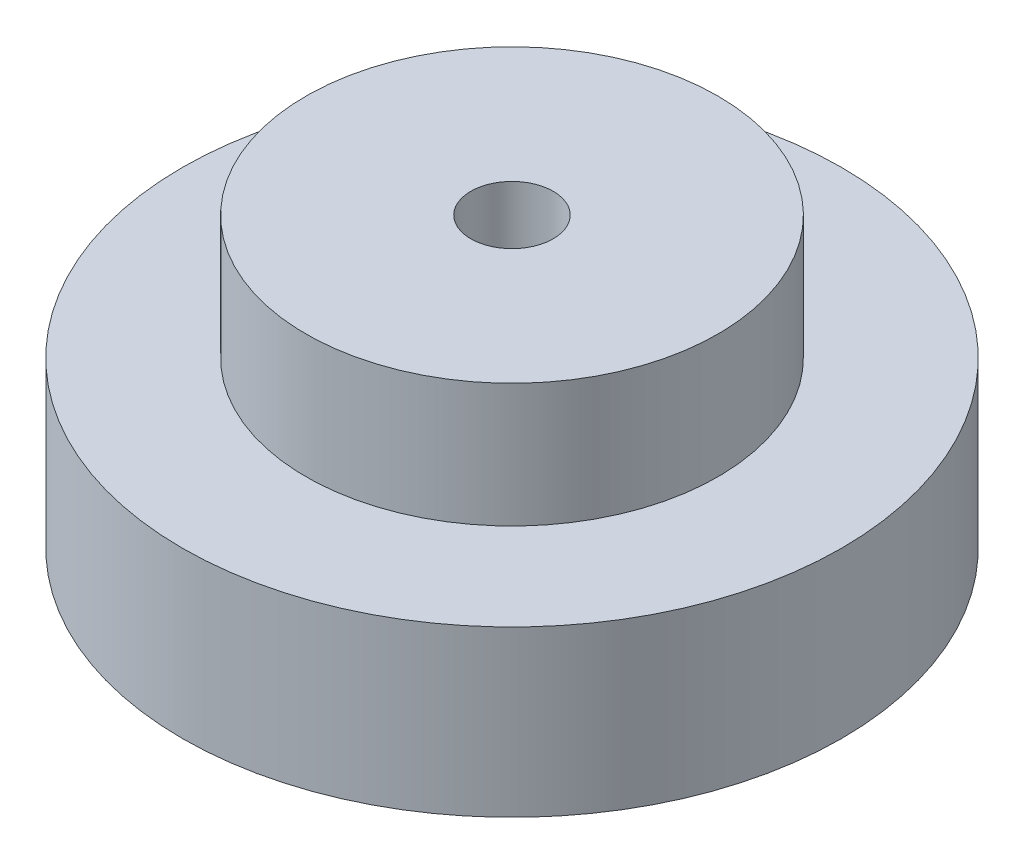
ISO-10303-21;
HEADER;
FILE_DESCRIPTION(('STEP AP214'),'2;1');
FILE_NAME('part.step','',(''),(''),'','','');
FILE_SCHEMA(('AUTOMOTIVE_DESIGN { 1 0 10303 214 1 1 1 1 }'));
ENDSEC;
DATA;
#1=APPLICATION_CONTEXT('core data for automotive mechanical design processes');
#2=APPLICATION_PROTOCOL_DEFINITION('international standard','automotive_design',2000,#1);
#3=PRODUCT_CONTEXT('',#1,'mechanical');
#4=PRODUCT('Part','Part','',(#3));
#5=PRODUCT_RELATED_PRODUCT_CATEGORY('part','',(#4));
#6=PRODUCT_DEFINITION_FORMATION('','',#4);
#7=PRODUCT_DEFINITION_CONTEXT('part definition',#1,'design');
#8=PRODUCT_DEFINITION('design','',#6,#7);
#9=PRODUCT_DEFINITION_SHAPE('','',#8);
#10=(LENGTH_UNIT() NAMED_UNIT(*) SI_UNIT(.MILLI.,.METRE.));
#11=(NAMED_UNIT(*) PLANE_ANGLE_UNIT() SI_UNIT($,.RADIAN.));
#12=(NAMED_UNIT(*) SI_UNIT($,.STERADIAN.) SOLID_ANGLE_UNIT());
#13=UNCERTAINTY_MEASURE_WITH_UNIT(LENGTH_MEASURE(1.E-05),#10,'distance_accuracy_value','');
#14=(GEOMETRIC_REPRESENTATION_CONTEXT(3) GLOBAL_UNCERTAINTY_ASSIGNED_CONTEXT((#13)) GLOBAL_UNIT_ASSIGNED_CONTEXT((#10,
#11,#12)) REPRESENTATION_CONTEXT('',''));
#15=CARTESIAN_POINT('',(0.,0.,0.));
#16=DIRECTION('',(0.,0.,1.));
#17=DIRECTION('',(1.,0.,0.));
#18=AXIS2_PLACEMENT_3D('',#15,#16,#17);
#19=CARTESIAN_POINT('',(0.,-30.,0.));
#20=DIRECTION('',(0.,-1.,0.));
#21=DIRECTION('',(0.,0.,-1.));
#22=AXIS2_PLACEMENT_3D('',#19,#20,#21);
#23=PLANE('',#22);
#24=CARTESIAN_POINT('',(0.,-30.,0.));
#25=DIRECTION('',(0.,-1.,0.));
#26=DIRECTION('',(0.,0.,-1.));
#27=AXIS2_PLACEMENT_3D('',#24,#25,#26);
#28=CIRCLE('',#27,2.49999999999999);
#29=CARTESIAN_POINT('',(0.,-30.,-2.49999999999999));
#30=VERTEX_POINT('',#29);
#31=EDGE_CURVE('E72',#30,#30,#28,.T.);
#32=ORIENTED_EDGE('',*,*,#31,.F.);
#33=EDGE_LOOP('',(#32));
#34=FACE_BOUND('',#33,.T.);
#35=CARTESIAN_POINT('',(0.,-30.,0.));
#36=DIRECTION('',(0.,-1.,0.));
#37=DIRECTION('',(0.,0.,-1.));
#38=AXIS2_PLACEMENT_3D('',#35,#36,#37);
#39=CIRCLE('',#38,15.);
#40=CARTESIAN_POINT('',(0.,-30.,-15.));
#41=VERTEX_POINT('',#40);
#42=EDGE_CURVE('E66',#41,#41,#39,.T.);
#43=ORIENTED_EDGE('',*,*,#42,.T.);
#44=EDGE_LOOP('',(#43));
#45=FACE_BOUND('',#44,.T.);
#46=ADVANCED_FACE('F38',(#34,#45),#23,.T.);
#47=CARTESIAN_POINT('',(10.,0.,0.));
#48=DIRECTION('',(0.,1.,0.));
#49=DIRECTION('',(0.,0.,1.));
#50=AXIS2_PLACEMENT_3D('',#47,#48,#49);
#51=PLANE('',#50);
#52=CARTESIAN_POINT('',(0.,0.,0.));
#53=DIRECTION('',(0.,1.,0.));
#54=DIRECTION('',(0.,0.,1.));
#55=AXIS2_PLACEMENT_3D('',#52,#53,#54);
#56=CIRCLE('',#55,2.49999999999999);
#57=CARTESIAN_POINT('',(0.,0.,2.49999999999999));
#58=VERTEX_POINT('',#57);
#59=EDGE_CURVE('E69',#58,#58,#56,.T.);
#60=ORIENTED_EDGE('',*,*,#59,.F.);
#61=EDGE_LOOP('',(#60));
#62=FACE_BOUND('',#61,.T.);
#63=CARTESIAN_POINT('',(0.,0.,0.));
#64=DIRECTION('',(0.,-1.,0.));
#65=DIRECTION('',(0.,0.,-1.));
#66=AXIS2_PLACEMENT_3D('',#63,#64,#65);
#67=CIRCLE('',#66,10.);
#68=CARTESIAN_POINT('',(0.,0.,-10.));
#69=VERTEX_POINT('',#68);
#70=EDGE_CURVE('E10',#69,#69,#67,.T.);
#71=ORIENTED_EDGE('',*,*,#70,.F.);
#72=EDGE_LOOP('',(#71));
#73=FACE_BOUND('',#72,.T.);
#74=ADVANCED_FACE('F80',(#62,#73),#51,.T.);
#75=CARTESIAN_POINT('',(0.,-30.,0.));
#76=DIRECTION('',(0.,-1.,0.));
#77=DIRECTION('',(0.,0.,-1.));
#78=AXIS2_PLACEMENT_3D('',#75,#76,#77);
#79=CYLINDRICAL_SURFACE('',#78,10.);
#80=ORIENTED_EDGE('',*,*,#70,.T.);
#81=EDGE_LOOP('',(#80));
#82=FACE_BOUND('',#81,.T.);
#83=CARTESIAN_POINT('',(0.,30.,0.));
#84=DIRECTION('',(0.,-1.,0.));
#85=DIRECTION('',(0.,0.,-1.));
#86=AXIS2_PLACEMENT_3D('',#83,#84,#85);
#87=CIRCLE('',#86,10.);
#88=CARTESIAN_POINT('',(0.,30.,-10.));
#89=VERTEX_POINT('',#88);
#90=EDGE_CURVE('E44',#89,#89,#87,.T.);
#91=ORIENTED_EDGE('',*,*,#90,.F.);
#92=EDGE_LOOP('',(#91));
#93=FACE_BOUND('',#92,.T.);
#94=ADVANCED_FACE('F112',(#82,#93),#79,.F.);
#95=CARTESIAN_POINT('',(10.,30.,0.));
#96=DIRECTION('',(0.,1.,0.));
#97=DIRECTION('',(0.,0.,1.));
#98=AXIS2_PLACEMENT_3D('',#95,#96,#97);
#99=PLANE('',#98);
#100=ORIENTED_EDGE('',*,*,#90,.T.);
#101=EDGE_LOOP('',(#100));
#102=FACE_BOUND('',#101,.T.);
#103=CARTESIAN_POINT('',(0.,30.,0.));
#104=DIRECTION('',(0.,-1.,0.));
#105=DIRECTION('',(0.,0.,-1.));
#106=AXIS2_PLACEMENT_3D('',#103,#104,#105);
#107=CIRCLE('',#106,50.);
#108=CARTESIAN_POINT('',(0.,30.,-50.));
#109=VERTEX_POINT('',#108);
#110=EDGE_CURVE('E48',#109,#109,#107,.T.);
#111=ORIENTED_EDGE('',*,*,#110,.F.);
#112=EDGE_LOOP('',(#111));
#113=FACE_BOUND('',#112,.T.);
#114=ADVANCED_FACE('F108',(#102,#113),#99,.T.);
#115=CARTESIAN_POINT('',(0.,-30.,0.));
#116=DIRECTION('',(0.,-1.,0.));
#117=DIRECTION('',(0.,0.,-1.));
#118=AXIS2_PLACEMENT_3D('',#115,#116,#117);
#119=CYLINDRICAL_SURFACE('',#118,50.);
#120=ORIENTED_EDGE('',*,*,#110,.T.);
#121=EDGE_LOOP('',(#120));
#122=FACE_BOUND('',#121,.T.);
#123=CARTESIAN_POINT('',(0.,0.,0.));
#124=DIRECTION('',(0.,-1.,0.));
#125=DIRECTION('',(0.,0.,-1.));
#126=AXIS2_PLACEMENT_3D('',#123,#124,#125);
#127=CIRCLE('',#126,50.);
#128=CARTESIAN_POINT('',(0.,0.,-50.));
#129=VERTEX_POINT('',#128);
#130=EDGE_CURVE('E52',#129,#129,#127,.T.);
#131=ORIENTED_EDGE('',*,*,#130,.F.);
#132=EDGE_LOOP('',(#131));
#133=FACE_BOUND('',#132,.T.);
#134=ADVANCED_FACE('F104',(#122,#133),#119,.T.);
#135=CARTESIAN_POINT('',(50.,0.,0.));
#136=DIRECTION('',(0.,1.,0.));
#137=DIRECTION('',(0.,0.,1.));
#138=AXIS2_PLACEMENT_3D('',#135,#136,#137);
#139=PLANE('',#138);
#140=ORIENTED_EDGE('',*,*,#130,.T.);
#141=EDGE_LOOP('',(#140));
#142=FACE_BOUND('',#141,.T.);
#143=CARTESIAN_POINT('',(0.,0.,0.));
#144=DIRECTION('',(0.,-1.,0.));
#145=DIRECTION('',(0.,0.,-1.));
#146=AXIS2_PLACEMENT_3D('',#143,#144,#145);
#147=CIRCLE('',#146,80.);
#148=CARTESIAN_POINT('',(0.,0.,-80.));
#149=VERTEX_POINT('',#148);
#150=EDGE_CURVE('E57',#149,#149,#147,.T.);
#151=ORIENTED_EDGE('',*,*,#150,.F.);
#152=EDGE_LOOP('',(#151));
#153=FACE_BOUND('',#152,.T.);
#154=ADVANCED_FACE('F100',(#142,#153),#139,.T.);
#155=CARTESIAN_POINT('',(0.,-30.,0.));
#156=DIRECTION('',(0.,-1.,0.));
#157=DIRECTION('',(0.,0.,-1.));
#158=AXIS2_PLACEMENT_3D('',#155,#156,#157);
#159=CYLINDRICAL_SURFACE('',#158,80.);
#160=ORIENTED_EDGE('',*,*,#150,.T.);
#161=EDGE_LOOP('',(#160));
#162=FACE_BOUND('',#161,.T.);
#163=CARTESIAN_POINT('',(0.,-40.,0.));
#164=DIRECTION('',(0.,-1.,0.));
#165=DIRECTION('',(0.,0.,-1.));
#166=AXIS2_PLACEMENT_3D('',#163,#164,#165);
#167=CIRCLE('',#166,80.);
#168=CARTESIAN_POINT('',(0.,-40.,-80.));
#169=VERTEX_POINT('',#168);
#170=EDGE_CURVE('E60',#169,#169,#167,.T.);
#171=ORIENTED_EDGE('',*,*,#170,.F.);
#172=EDGE_LOOP('',(#171));
#173=FACE_BOUND('',#172,.T.);
#174=ADVANCED_FACE('F94',(#162,#173),#159,.T.);
#175=CARTESIAN_POINT('',(33.1915100133402,-40.,0.));
#176=DIRECTION('',(0.,-1.,0.));
#177=DIRECTION('',(0.,0.,-1.));
#178=AXIS2_PLACEMENT_3D('',#175,#176,#177);
#179=PLANE('',#178);
#180=ORIENTED_EDGE('',*,*,#170,.T.);
#181=EDGE_LOOP('',(#180));
#182=FACE_BOUND('',#181,.T.);
#183=CARTESIAN_POINT('',(0.,-40.,0.));
#184=DIRECTION('',(0.,-1.,0.));
#185=DIRECTION('',(0.,0.,-1.));
#186=AXIS2_PLACEMENT_3D('',#183,#184,#185);
#187=CIRCLE('',#186,15.);
#188=CARTESIAN_POINT('',(0.,-40.,-15.));
#189=VERTEX_POINT('',#188);
#190=EDGE_CURVE('E63',#189,#189,#187,.T.);
#191=ORIENTED_EDGE('',*,*,#190,.F.);
#192=EDGE_LOOP('',(#191));
#193=FACE_BOUND('',#192,.T.);
#194=ADVANCED_FACE('F85',(#182,#193),#179,.T.);
#195=CARTESIAN_POINT('',(0.,-30.,0.));
#196=DIRECTION('',(0.,-1.,0.));
#197=DIRECTION('',(0.,0.,-1.));
#198=AXIS2_PLACEMENT_3D('',#195,#196,#197);
#199=CYLINDRICAL_SURFACE('',#198,15.);
#200=ORIENTED_EDGE('',*,*,#190,.T.);
#201=EDGE_LOOP('',(#200));
#202=FACE_BOUND('',#201,.T.);
#203=ORIENTED_EDGE('',*,*,#42,.F.);
#204=EDGE_LOOP('',(#203));
#205=FACE_BOUND('',#204,.T.);
#206=ADVANCED_FACE('F83',(#202,#205),#199,.F.);
#207=CARTESIAN_POINT('',(0.,-30.,0.));
#208=DIRECTION('',(0.,-1.,0.));
#209=DIRECTION('',(0.,0.,-1.));
#210=AXIS2_PLACEMENT_3D('',#207,#208,#209);
#211=CYLINDRICAL_SURFACE('',#210,2.49999999999999);
#212=ORIENTED_EDGE('',*,*,#59,.T.);
#213=EDGE_LOOP('',(#212));
#214=FACE_BOUND('',#213,.T.);
#215=ORIENTED_EDGE('',*,*,#31,.T.);
#216=EDGE_LOOP('',(#215));
#217=FACE_BOUND('',#216,.T.);
#218=ADVANCED_FACE('F76',(#214,#217),#211,.F.);
#219=CLOSED_SHELL('',(#46,#74,#94,#114,#134,#154,#174,#194,#206,#218));
#220=MANIFOLD_SOLID_BREP('B2',#219);
#221=ADVANCED_BREP_SHAPE_REPRESENTATION('',(#18,#220),#14);
#222=SHAPE_DEFINITION_REPRESENTATION(#9,#221);
ENDSEC;
END-ISO-10303-21;
